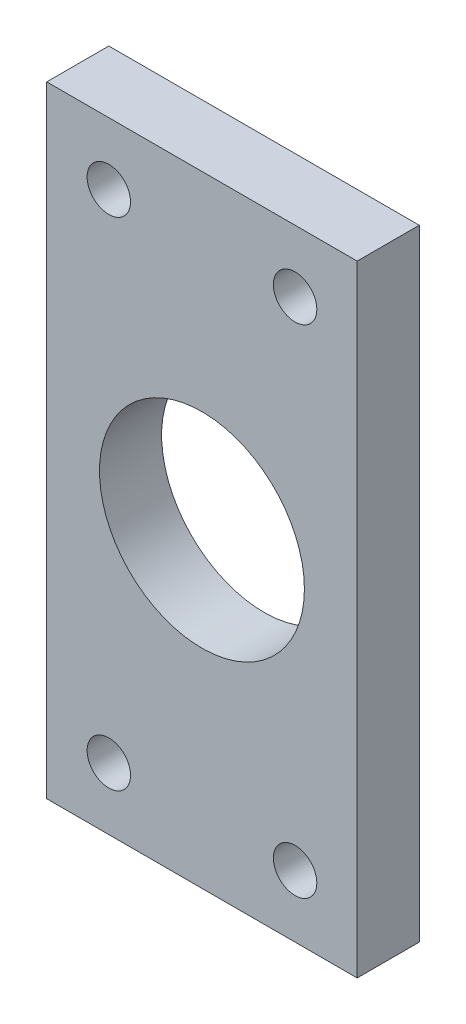
ISO-10303-21;
HEADER;
FILE_DESCRIPTION(('STEP AP214'),'2;1');
FILE_NAME('part.step','',(''),(''),'','','');
FILE_SCHEMA(('AUTOMOTIVE_DESIGN { 1 0 10303 214 1 1 1 1 }'));
ENDSEC;
DATA;
#1=APPLICATION_CONTEXT('core data for automotive mechanical design processes');
#2=APPLICATION_PROTOCOL_DEFINITION('international standard','automotive_design',2000,#1);
#3=PRODUCT_CONTEXT('',#1,'mechanical');
#4=PRODUCT('Part','Part','',(#3));
#5=PRODUCT_RELATED_PRODUCT_CATEGORY('part','',(#4));
#6=PRODUCT_DEFINITION_FORMATION('','',#4);
#7=PRODUCT_DEFINITION_CONTEXT('part definition',#1,'design');
#8=PRODUCT_DEFINITION('design','',#6,#7);
#9=PRODUCT_DEFINITION_SHAPE('','',#8);
#10=(LENGTH_UNIT() NAMED_UNIT(*) SI_UNIT(.MILLI.,.METRE.));
#11=(NAMED_UNIT(*) PLANE_ANGLE_UNIT() SI_UNIT($,.RADIAN.));
#12=(NAMED_UNIT(*) SI_UNIT($,.STERADIAN.) SOLID_ANGLE_UNIT());
#13=UNCERTAINTY_MEASURE_WITH_UNIT(LENGTH_MEASURE(1.E-05),#10,'distance_accuracy_value','');
#14=(GEOMETRIC_REPRESENTATION_CONTEXT(3) GLOBAL_UNCERTAINTY_ASSIGNED_CONTEXT((#13)) GLOBAL_UNIT_ASSIGNED_CONTEXT((#10,
#11,#12)) REPRESENTATION_CONTEXT('',''));
#15=CARTESIAN_POINT('',(0.,0.,0.));
#16=DIRECTION('',(0.,0.,1.));
#17=DIRECTION('',(1.,0.,0.));
#18=AXIS2_PLACEMENT_3D('',#15,#16,#17);
#19=CARTESIAN_POINT('',(0.,0.,5.));
#20=DIRECTION('',(0.,0.,1.));
#21=DIRECTION('',(1.,0.,0.));
#22=AXIS2_PLACEMENT_3D('',#19,#20,#21);
#23=PLANE('',#22);
#24=CARTESIAN_POINT('',(-7.5,-20.,5.));
#25=DIRECTION('',(0.,0.,1.));
#26=DIRECTION('',(1.,0.,0.));
#27=AXIS2_PLACEMENT_3D('',#24,#25,#26);
#28=CIRCLE('',#27,1.75);
#29=CARTESIAN_POINT('',(-5.75,-20.,5.));
#30=VERTEX_POINT('',#29);
#31=EDGE_CURVE('E129',#30,#30,#28,.T.);
#32=ORIENTED_EDGE('',*,*,#31,.F.);
#33=EDGE_LOOP('',(#32));
#34=FACE_BOUND('',#33,.T.);
#35=CARTESIAN_POINT('',(-7.5,20.,5.));
#36=DIRECTION('',(0.,0.,1.));
#37=DIRECTION('',(1.,0.,0.));
#38=AXIS2_PLACEMENT_3D('',#35,#36,#37);
#39=CIRCLE('',#38,1.75);
#40=CARTESIAN_POINT('',(-5.75,20.,5.));
#41=VERTEX_POINT('',#40);
#42=EDGE_CURVE('E117',#41,#41,#39,.T.);
#43=ORIENTED_EDGE('',*,*,#42,.F.);
#44=EDGE_LOOP('',(#43));
#45=FACE_BOUND('',#44,.T.);
#46=DIRECTION('',(0.,1.,0.));
#47=VECTOR('',#46,1.);
#48=CARTESIAN_POINT('',(12.5,25.,5.));
#49=LINE('',#48,#47);
#50=CARTESIAN_POINT('',(12.5,-25.,5.));
#51=VERTEX_POINT('',#50);
#52=CARTESIAN_POINT('',(12.5,25.,5.));
#53=VERTEX_POINT('',#52);
#54=EDGE_CURVE('E87',#51,#53,#49,.T.);
#55=ORIENTED_EDGE('',*,*,#54,.T.);
#56=DIRECTION('',(-1.,0.,0.));
#57=VECTOR('',#56,1.);
#58=CARTESIAN_POINT('',(-12.5,25.,5.));
#59=LINE('',#58,#57);
#60=CARTESIAN_POINT('',(-12.5,25.,5.));
#61=VERTEX_POINT('',#60);
#62=EDGE_CURVE('E82',#53,#61,#59,.T.);
#63=ORIENTED_EDGE('',*,*,#62,.T.);
#64=DIRECTION('',(0.,-1.,0.));
#65=VECTOR('',#64,1.);
#66=CARTESIAN_POINT('',(-12.5,25.,5.));
#67=LINE('',#66,#65);
#68=CARTESIAN_POINT('',(-12.5,-25.,5.));
#69=VERTEX_POINT('',#68);
#70=EDGE_CURVE('E85',#61,#69,#67,.T.);
#71=ORIENTED_EDGE('',*,*,#70,.T.);
#72=DIRECTION('',(1.,0.,0.));
#73=VECTOR('',#72,1.);
#74=CARTESIAN_POINT('',(-12.5,-25.,5.));
#75=LINE('',#74,#73);
#76=EDGE_CURVE('E52',#69,#51,#75,.T.);
#77=ORIENTED_EDGE('',*,*,#76,.T.);
#78=EDGE_LOOP('',(#55,#63,#71,#77));
#79=FACE_BOUND('',#78,.T.);
#80=CARTESIAN_POINT('',(0.,0.,5.));
#81=DIRECTION('',(0.,0.,1.));
#82=DIRECTION('',(1.,0.,0.));
#83=AXIS2_PLACEMENT_3D('',#80,#81,#82);
#84=CIRCLE('',#83,8.25);
#85=CARTESIAN_POINT('',(8.25,0.,5.));
#86=VERTEX_POINT('',#85);
#87=EDGE_CURVE('E102',#86,#86,#84,.T.);
#88=ORIENTED_EDGE('',*,*,#87,.F.);
#89=EDGE_LOOP('',(#88));
#90=FACE_BOUND('',#89,.T.);
#91=CARTESIAN_POINT('',(7.5,20.,5.));
#92=DIRECTION('',(0.,0.,1.));
#93=DIRECTION('',(1.,0.,0.));
#94=AXIS2_PLACEMENT_3D('',#91,#92,#93);
#95=CIRCLE('',#94,1.75);
#96=CARTESIAN_POINT('',(9.25,20.,5.));
#97=VERTEX_POINT('',#96);
#98=EDGE_CURVE('E123',#97,#97,#95,.T.);
#99=ORIENTED_EDGE('',*,*,#98,.F.);
#100=EDGE_LOOP('',(#99));
#101=FACE_BOUND('',#100,.T.);
#102=CARTESIAN_POINT('',(7.5,-20.,5.));
#103=DIRECTION('',(0.,0.,1.));
#104=DIRECTION('',(1.,0.,0.));
#105=AXIS2_PLACEMENT_3D('',#102,#103,#104);
#106=CIRCLE('',#105,1.75);
#107=CARTESIAN_POINT('',(9.25,-20.,5.));
#108=VERTEX_POINT('',#107);
#109=EDGE_CURVE('E135',#108,#108,#106,.T.);
#110=ORIENTED_EDGE('',*,*,#109,.F.);
#111=EDGE_LOOP('',(#110));
#112=FACE_BOUND('',#111,.T.);
#113=ADVANCED_FACE('F35',(#34,#45,#79,#90,#101,#112),#23,.T.);
#114=CARTESIAN_POINT('',(0.,0.,0.));
#115=DIRECTION('',(0.,0.,1.));
#116=DIRECTION('',(1.,0.,0.));
#117=AXIS2_PLACEMENT_3D('',#114,#115,#116);
#118=PLANE('',#117);
#119=DIRECTION('',(0.,1.,0.));
#120=VECTOR('',#119,1.);
#121=CARTESIAN_POINT('',(12.5,25.,0.));
#122=LINE('',#121,#120);
#123=CARTESIAN_POINT('',(12.5,-25.,0.));
#124=VERTEX_POINT('',#123);
#125=CARTESIAN_POINT('',(12.5,25.,0.));
#126=VERTEX_POINT('',#125);
#127=EDGE_CURVE('E99',#124,#126,#122,.T.);
#128=ORIENTED_EDGE('',*,*,#127,.F.);
#129=DIRECTION('',(1.,0.,0.));
#130=VECTOR('',#129,1.);
#131=CARTESIAN_POINT('',(-12.5,-25.,0.));
#132=LINE('',#131,#130);
#133=CARTESIAN_POINT('',(-12.5,-25.,0.));
#134=VERTEX_POINT('',#133);
#135=EDGE_CURVE('E75',#134,#124,#132,.T.);
#136=ORIENTED_EDGE('',*,*,#135,.F.);
#137=DIRECTION('',(0.,-1.,0.));
#138=VECTOR('',#137,1.);
#139=CARTESIAN_POINT('',(-12.5,25.,0.));
#140=LINE('',#139,#138);
#141=CARTESIAN_POINT('',(-12.5,25.,0.));
#142=VERTEX_POINT('',#141);
#143=EDGE_CURVE('E69',#142,#134,#140,.T.);
#144=ORIENTED_EDGE('',*,*,#143,.F.);
#145=DIRECTION('',(-1.,0.,0.));
#146=VECTOR('',#145,1.);
#147=CARTESIAN_POINT('',(-12.5,25.,0.));
#148=LINE('',#147,#146);
#149=EDGE_CURVE('E91',#126,#142,#148,.T.);
#150=ORIENTED_EDGE('',*,*,#149,.F.);
#151=EDGE_LOOP('',(#128,#136,#144,#150));
#152=FACE_BOUND('',#151,.T.);
#153=CARTESIAN_POINT('',(0.,0.,0.));
#154=DIRECTION('',(0.,0.,1.));
#155=DIRECTION('',(1.,0.,0.));
#156=AXIS2_PLACEMENT_3D('',#153,#154,#155);
#157=CIRCLE('',#156,8.25);
#158=CARTESIAN_POINT('',(8.25,0.,0.));
#159=VERTEX_POINT('',#158);
#160=EDGE_CURVE('E114',#159,#159,#157,.T.);
#161=ORIENTED_EDGE('',*,*,#160,.T.);
#162=EDGE_LOOP('',(#161));
#163=FACE_BOUND('',#162,.T.);
#164=CARTESIAN_POINT('',(-7.5,20.,0.));
#165=DIRECTION('',(0.,0.,1.));
#166=DIRECTION('',(1.,0.,0.));
#167=AXIS2_PLACEMENT_3D('',#164,#165,#166);
#168=CIRCLE('',#167,1.75);
#169=CARTESIAN_POINT('',(-5.75,20.,0.));
#170=VERTEX_POINT('',#169);
#171=EDGE_CURVE('E120',#170,#170,#168,.T.);
#172=ORIENTED_EDGE('',*,*,#171,.T.);
#173=EDGE_LOOP('',(#172));
#174=FACE_BOUND('',#173,.T.);
#175=CARTESIAN_POINT('',(7.5,20.,0.));
#176=DIRECTION('',(0.,0.,1.));
#177=DIRECTION('',(1.,0.,0.));
#178=AXIS2_PLACEMENT_3D('',#175,#176,#177);
#179=CIRCLE('',#178,1.75);
#180=CARTESIAN_POINT('',(9.25,20.,0.));
#181=VERTEX_POINT('',#180);
#182=EDGE_CURVE('E126',#181,#181,#179,.T.);
#183=ORIENTED_EDGE('',*,*,#182,.T.);
#184=EDGE_LOOP('',(#183));
#185=FACE_BOUND('',#184,.T.);
#186=CARTESIAN_POINT('',(-7.5,-20.,0.));
#187=DIRECTION('',(0.,0.,1.));
#188=DIRECTION('',(1.,0.,0.));
#189=AXIS2_PLACEMENT_3D('',#186,#187,#188);
#190=CIRCLE('',#189,1.75);
#191=CARTESIAN_POINT('',(-5.75,-20.,0.));
#192=VERTEX_POINT('',#191);
#193=EDGE_CURVE('E132',#192,#192,#190,.T.);
#194=ORIENTED_EDGE('',*,*,#193,.T.);
#195=EDGE_LOOP('',(#194));
#196=FACE_BOUND('',#195,.T.);
#197=CARTESIAN_POINT('',(7.5,-20.,0.));
#198=DIRECTION('',(0.,0.,1.));
#199=DIRECTION('',(1.,0.,0.));
#200=AXIS2_PLACEMENT_3D('',#197,#198,#199);
#201=CIRCLE('',#200,1.75);
#202=CARTESIAN_POINT('',(9.25,-20.,0.));
#203=VERTEX_POINT('',#202);
#204=EDGE_CURVE('E138',#203,#203,#201,.T.);
#205=ORIENTED_EDGE('',*,*,#204,.T.);
#206=EDGE_LOOP('',(#205));
#207=FACE_BOUND('',#206,.T.);
#208=ADVANCED_FACE('F110',(#152,#163,#174,#185,#196,#207),#118,.F.);
#209=CARTESIAN_POINT('',(12.5,25.,5.));
#210=DIRECTION('',(-1.,0.,0.));
#211=DIRECTION('',(0.,-1.,0.));
#212=AXIS2_PLACEMENT_3D('',#209,#210,#211);
#213=PLANE('',#212);
#214=ORIENTED_EDGE('',*,*,#127,.T.);
#215=DIRECTION('',(0.,0.,-1.));
#216=VECTOR('',#215,1.);
#217=CARTESIAN_POINT('',(12.5,25.,5.));
#218=LINE('',#217,#216);
#219=EDGE_CURVE('E11',#53,#126,#218,.T.);
#220=ORIENTED_EDGE('',*,*,#219,.F.);
#221=ORIENTED_EDGE('',*,*,#54,.F.);
#222=DIRECTION('',(0.,0.,-1.));
#223=VECTOR('',#222,1.);
#224=CARTESIAN_POINT('',(12.5,-25.,5.));
#225=LINE('',#224,#223);
#226=EDGE_CURVE('E95',#51,#124,#225,.T.);
#227=ORIENTED_EDGE('',*,*,#226,.T.);
#228=EDGE_LOOP('',(#214,#220,#221,#227));
#229=FACE_BOUND('',#228,.T.);
#230=ADVANCED_FACE('F37',(#229),#213,.F.);
#231=CARTESIAN_POINT('',(-12.5,25.,5.));
#232=DIRECTION('',(0.,-1.,0.));
#233=DIRECTION('',(0.,0.,-1.));
#234=AXIS2_PLACEMENT_3D('',#231,#232,#233);
#235=PLANE('',#234);
#236=ORIENTED_EDGE('',*,*,#149,.T.);
#237=DIRECTION('',(0.,0.,-1.));
#238=VECTOR('',#237,1.);
#239=CARTESIAN_POINT('',(-12.5,25.,5.));
#240=LINE('',#239,#238);
#241=EDGE_CURVE('E44',#61,#142,#240,.T.);
#242=ORIENTED_EDGE('',*,*,#241,.F.);
#243=ORIENTED_EDGE('',*,*,#62,.F.);
#244=ORIENTED_EDGE('',*,*,#219,.T.);
#245=EDGE_LOOP('',(#236,#242,#243,#244));
#246=FACE_BOUND('',#245,.T.);
#247=ADVANCED_FACE('F90',(#246),#235,.F.);
#248=CARTESIAN_POINT('',(-12.5,25.,5.));
#249=DIRECTION('',(1.,0.,0.));
#250=DIRECTION('',(0.,1.,0.));
#251=AXIS2_PLACEMENT_3D('',#248,#249,#250);
#252=PLANE('',#251);
#253=ORIENTED_EDGE('',*,*,#143,.T.);
#254=DIRECTION('',(0.,0.,-1.));
#255=VECTOR('',#254,1.);
#256=CARTESIAN_POINT('',(-12.5,-25.,5.));
#257=LINE('',#256,#255);
#258=EDGE_CURVE('E92',#69,#134,#257,.T.);
#259=ORIENTED_EDGE('',*,*,#258,.F.);
#260=ORIENTED_EDGE('',*,*,#70,.F.);
#261=ORIENTED_EDGE('',*,*,#241,.T.);
#262=EDGE_LOOP('',(#253,#259,#260,#261));
#263=FACE_BOUND('',#262,.T.);
#264=ADVANCED_FACE('F93',(#263),#252,.F.);
#265=CARTESIAN_POINT('',(-12.5,-25.,5.));
#266=DIRECTION('',(0.,1.,0.));
#267=DIRECTION('',(0.,0.,1.));
#268=AXIS2_PLACEMENT_3D('',#265,#266,#267);
#269=PLANE('',#268);
#270=ORIENTED_EDGE('',*,*,#135,.T.);
#271=ORIENTED_EDGE('',*,*,#226,.F.);
#272=ORIENTED_EDGE('',*,*,#76,.F.);
#273=ORIENTED_EDGE('',*,*,#258,.T.);
#274=EDGE_LOOP('',(#270,#271,#272,#273));
#275=FACE_BOUND('',#274,.T.);
#276=ADVANCED_FACE('F107',(#275),#269,.F.);
#277=CARTESIAN_POINT('',(0.,0.,5.));
#278=DIRECTION('',(0.,0.,-1.));
#279=DIRECTION('',(-1.,0.,0.));
#280=AXIS2_PLACEMENT_3D('',#277,#278,#279);
#281=CYLINDRICAL_SURFACE('',#280,8.25);
#282=ORIENTED_EDGE('',*,*,#87,.T.);
#283=EDGE_LOOP('',(#282));
#284=FACE_BOUND('',#283,.T.);
#285=ORIENTED_EDGE('',*,*,#160,.F.);
#286=EDGE_LOOP('',(#285));
#287=FACE_BOUND('',#286,.T.);
#288=ADVANCED_FACE('F157',(#284,#287),#281,.F.);
#289=CARTESIAN_POINT('',(-7.5,20.,5.));
#290=DIRECTION('',(0.,0.,-1.));
#291=DIRECTION('',(-1.,0.,0.));
#292=AXIS2_PLACEMENT_3D('',#289,#290,#291);
#293=CYLINDRICAL_SURFACE('',#292,1.75);
#294=ORIENTED_EDGE('',*,*,#42,.T.);
#295=EDGE_LOOP('',(#294));
#296=FACE_BOUND('',#295,.T.);
#297=ORIENTED_EDGE('',*,*,#171,.F.);
#298=EDGE_LOOP('',(#297));
#299=FACE_BOUND('',#298,.T.);
#300=ADVANCED_FACE('F203',(#296,#299),#293,.F.);
#301=CARTESIAN_POINT('',(7.5,20.,5.));
#302=DIRECTION('',(0.,0.,-1.));
#303=DIRECTION('',(-1.,0.,0.));
#304=AXIS2_PLACEMENT_3D('',#301,#302,#303);
#305=CYLINDRICAL_SURFACE('',#304,1.75);
#306=ORIENTED_EDGE('',*,*,#98,.T.);
#307=EDGE_LOOP('',(#306));
#308=FACE_BOUND('',#307,.T.);
#309=ORIENTED_EDGE('',*,*,#182,.F.);
#310=EDGE_LOOP('',(#309));
#311=FACE_BOUND('',#310,.T.);
#312=ADVANCED_FACE('F211',(#308,#311),#305,.F.);
#313=CARTESIAN_POINT('',(-7.5,-20.,5.));
#314=DIRECTION('',(0.,0.,-1.));
#315=DIRECTION('',(-1.,0.,0.));
#316=AXIS2_PLACEMENT_3D('',#313,#314,#315);
#317=CYLINDRICAL_SURFACE('',#316,1.75);
#318=ORIENTED_EDGE('',*,*,#31,.T.);
#319=EDGE_LOOP('',(#318));
#320=FACE_BOUND('',#319,.T.);
#321=ORIENTED_EDGE('',*,*,#193,.F.);
#322=EDGE_LOOP('',(#321));
#323=FACE_BOUND('',#322,.T.);
#324=ADVANCED_FACE('F219',(#320,#323),#317,.F.);
#325=CARTESIAN_POINT('',(7.5,-20.,5.));
#326=DIRECTION('',(0.,0.,-1.));
#327=DIRECTION('',(-1.,0.,0.));
#328=AXIS2_PLACEMENT_3D('',#325,#326,#327);
#329=CYLINDRICAL_SURFACE('',#328,1.75);
#330=ORIENTED_EDGE('',*,*,#109,.T.);
#331=EDGE_LOOP('',(#330));
#332=FACE_BOUND('',#331,.T.);
#333=ORIENTED_EDGE('',*,*,#204,.F.);
#334=EDGE_LOOP('',(#333));
#335=FACE_BOUND('',#334,.T.);
#336=ADVANCED_FACE('F144',(#332,#335),#329,.F.);
#337=CLOSED_SHELL('',(#113,#208,#230,#247,#264,#276,#288,#300,#312,#324,#336));
#338=MANIFOLD_SOLID_BREP('B2',#337);
#339=ADVANCED_BREP_SHAPE_REPRESENTATION('',(#18,#338),#14);
#340=SHAPE_DEFINITION_REPRESENTATION(#9,#339);
ENDSEC;
END-ISO-10303-21;
